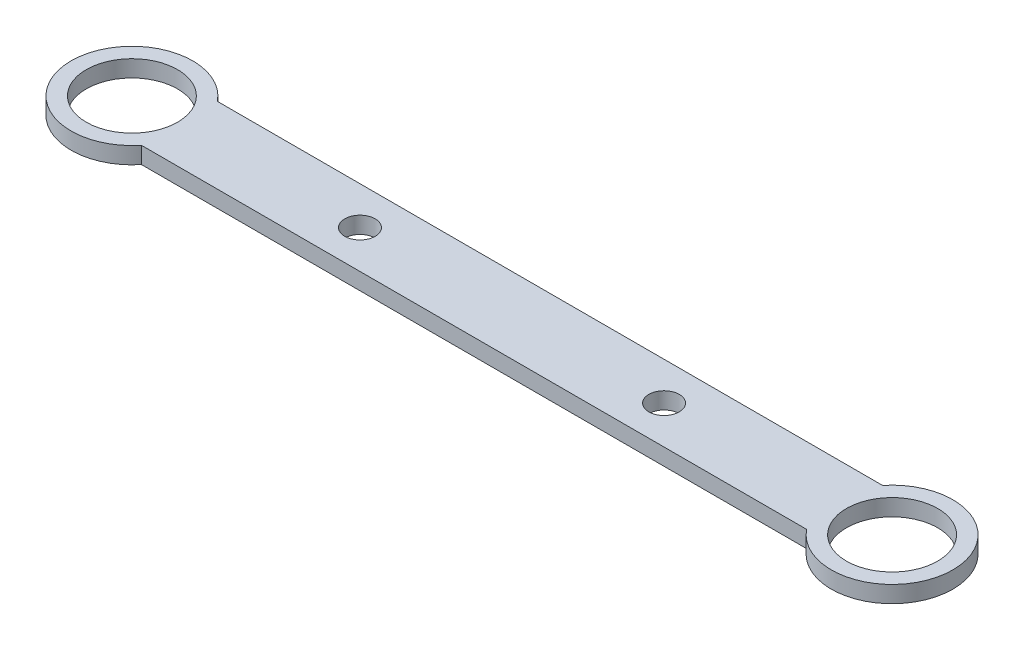
ISO-10303-21;
HEADER;
FILE_DESCRIPTION(('STEP AP214'),'2;1');
FILE_NAME('part.step','',(''),(''),'','','');
FILE_SCHEMA(('AUTOMOTIVE_DESIGN { 1 0 10303 214 1 1 1 1 }'));
ENDSEC;
DATA;
#1=APPLICATION_CONTEXT('core data for automotive mechanical design processes');
#2=APPLICATION_PROTOCOL_DEFINITION('international standard','automotive_design',2000,#1);
#3=PRODUCT_CONTEXT('',#1,'mechanical');
#4=PRODUCT('Part','Part','',(#3));
#5=PRODUCT_RELATED_PRODUCT_CATEGORY('part','',(#4));
#6=PRODUCT_DEFINITION_FORMATION('','',#4);
#7=PRODUCT_DEFINITION_CONTEXT('part definition',#1,'design');
#8=PRODUCT_DEFINITION('design','',#6,#7);
#9=PRODUCT_DEFINITION_SHAPE('','',#8);
#10=(LENGTH_UNIT() NAMED_UNIT(*) SI_UNIT(.MILLI.,.METRE.));
#11=(NAMED_UNIT(*) PLANE_ANGLE_UNIT() SI_UNIT($,.RADIAN.));
#12=(NAMED_UNIT(*) SI_UNIT($,.STERADIAN.) SOLID_ANGLE_UNIT());
#13=UNCERTAINTY_MEASURE_WITH_UNIT(LENGTH_MEASURE(1.E-05),#10,'distance_accuracy_value','');
#14=(GEOMETRIC_REPRESENTATION_CONTEXT(3) GLOBAL_UNCERTAINTY_ASSIGNED_CONTEXT((#13)) GLOBAL_UNIT_ASSIGNED_CONTEXT((#10,
#11,#12)) REPRESENTATION_CONTEXT('',''));
#15=CARTESIAN_POINT('',(0.,0.,0.));
#16=DIRECTION('',(0.,0.,1.));
#17=DIRECTION('',(1.,0.,0.));
#18=AXIS2_PLACEMENT_3D('',#15,#16,#17);
#19=CARTESIAN_POINT('',(0.,1.1,0.));
#20=DIRECTION('',(0.,1.,0.));
#21=DIRECTION('',(0.,0.,1.));
#22=AXIS2_PLACEMENT_3D('',#19,#20,#21);
#23=PLANE('',#22);
#24=CARTESIAN_POINT('',(0.,1.1,0.));
#25=DIRECTION('',(0.,1.,0.));
#26=DIRECTION('',(0.,0.,1.));
#27=AXIS2_PLACEMENT_3D('',#24,#25,#26);
#28=CIRCLE('',#27,4.);
#29=CARTESIAN_POINT('',(3.1224989991992,1.1,-2.5));
#30=VERTEX_POINT('',#29);
#31=CARTESIAN_POINT('',(3.1224989991992,1.1,2.5));
#32=VERTEX_POINT('',#31);
#33=EDGE_CURVE('E246',#30,#32,#28,.T.);
#34=ORIENTED_EDGE('',*,*,#33,.T.);
#35=DIRECTION('',(1.,0.,0.));
#36=VECTOR('',#35,1.);
#37=CARTESIAN_POINT('',(3.1224989991992,1.1,2.5));
#38=LINE('',#37,#36);
#39=CARTESIAN_POINT('',(46.8775010008008,1.1,2.5));
#40=VERTEX_POINT('',#39);
#41=EDGE_CURVE('E167',#32,#40,#38,.T.);
#42=ORIENTED_EDGE('',*,*,#41,.T.);
#43=CARTESIAN_POINT('',(50.,1.1,0.));
#44=DIRECTION('',(0.,1.,0.));
#45=DIRECTION('',(0.,0.,1.));
#46=AXIS2_PLACEMENT_3D('',#43,#44,#45);
#47=CIRCLE('',#46,4.);
#48=CARTESIAN_POINT('',(46.8775010008008,1.1,-2.5));
#49=VERTEX_POINT('',#48);
#50=EDGE_CURVE('E162',#40,#49,#47,.T.);
#51=ORIENTED_EDGE('',*,*,#50,.T.);
#52=DIRECTION('',(1.,0.,0.));
#53=VECTOR('',#52,1.);
#54=CARTESIAN_POINT('',(3.1224989991992,1.1,-2.5));
#55=LINE('',#54,#53);
#56=EDGE_CURVE('E156',#30,#49,#55,.T.);
#57=ORIENTED_EDGE('',*,*,#56,.F.);
#58=EDGE_LOOP('',(#34,#42,#51,#57));
#59=FACE_BOUND('',#58,.T.);
#60=CARTESIAN_POINT('',(0.,1.1,0.));
#61=DIRECTION('',(0.,1.,0.));
#62=DIRECTION('',(0.,0.,1.));
#63=AXIS2_PLACEMENT_3D('',#60,#61,#62);
#64=CIRCLE('',#63,3.);
#65=CARTESIAN_POINT('',(0.,1.1,3.));
#66=VERTEX_POINT('',#65);
#67=EDGE_CURVE('E240',#66,#66,#64,.T.);
#68=ORIENTED_EDGE('',*,*,#67,.F.);
#69=EDGE_LOOP('',(#68));
#70=FACE_BOUND('',#69,.T.);
#71=CARTESIAN_POINT('',(15.,1.1,0.));
#72=DIRECTION('',(0.,1.,0.));
#73=DIRECTION('',(0.,0.,1.));
#74=AXIS2_PLACEMENT_3D('',#71,#72,#73);
#75=CIRCLE('',#74,1.);
#76=CARTESIAN_POINT('',(15.,1.1,1.));
#77=VERTEX_POINT('',#76);
#78=EDGE_CURVE('E172',#77,#77,#75,.T.);
#79=ORIENTED_EDGE('',*,*,#78,.F.);
#80=EDGE_LOOP('',(#79));
#81=FACE_BOUND('',#80,.T.);
#82=CARTESIAN_POINT('',(35.,1.1,0.));
#83=DIRECTION('',(0.,1.,0.));
#84=DIRECTION('',(0.,0.,1.));
#85=AXIS2_PLACEMENT_3D('',#82,#83,#84);
#86=CIRCLE('',#85,0.999999999999998);
#87=CARTESIAN_POINT('',(35.,1.1,0.999999999999998));
#88=VERTEX_POINT('',#87);
#89=EDGE_CURVE('E185',#88,#88,#86,.T.);
#90=ORIENTED_EDGE('',*,*,#89,.F.);
#91=EDGE_LOOP('',(#90));
#92=FACE_BOUND('',#91,.T.);
#93=CARTESIAN_POINT('',(50.,1.1,0.));
#94=DIRECTION('',(0.,1.,0.));
#95=DIRECTION('',(0.,0.,1.));
#96=AXIS2_PLACEMENT_3D('',#93,#94,#95);
#97=CIRCLE('',#96,3.);
#98=CARTESIAN_POINT('',(50.,1.1,3.));
#99=VERTEX_POINT('',#98);
#100=EDGE_CURVE('E163',#99,#99,#97,.T.);
#101=ORIENTED_EDGE('',*,*,#100,.F.);
#102=EDGE_LOOP('',(#101));
#103=FACE_BOUND('',#102,.T.);
#104=ADVANCED_FACE('F110',(#59,#70,#81,#92,#103),#23,.T.);
#105=CARTESIAN_POINT('',(0.,1.1,0.));
#106=DIRECTION('',(0.,-1.,0.));
#107=DIRECTION('',(0.,0.,-1.));
#108=AXIS2_PLACEMENT_3D('',#105,#106,#107);
#109=CYLINDRICAL_SURFACE('',#108,3.);
#110=ORIENTED_EDGE('',*,*,#67,.T.);
#111=EDGE_LOOP('',(#110));
#112=FACE_BOUND('',#111,.T.);
#113=CARTESIAN_POINT('',(0.,0.,0.));
#114=DIRECTION('',(0.,1.,0.));
#115=DIRECTION('',(0.,0.,1.));
#116=AXIS2_PLACEMENT_3D('',#113,#114,#115);
#117=CIRCLE('',#116,3.);
#118=CARTESIAN_POINT('',(0.,0.,3.));
#119=VERTEX_POINT('',#118);
#120=EDGE_CURVE('E177',#119,#119,#117,.T.);
#121=ORIENTED_EDGE('',*,*,#120,.F.);
#122=EDGE_LOOP('',(#121));
#123=FACE_BOUND('',#122,.T.);
#124=ADVANCED_FACE('F225',(#112,#123),#109,.F.);
#125=CARTESIAN_POINT('',(0.,0.,0.));
#126=DIRECTION('',(0.,1.,0.));
#127=DIRECTION('',(0.,0.,1.));
#128=AXIS2_PLACEMENT_3D('',#125,#126,#127);
#129=PLANE('',#128);
#130=CARTESIAN_POINT('',(0.,0.,0.));
#131=DIRECTION('',(0.,1.,0.));
#132=DIRECTION('',(0.,0.,1.));
#133=AXIS2_PLACEMENT_3D('',#130,#131,#132);
#134=CIRCLE('',#133,4.);
#135=CARTESIAN_POINT('',(3.1224989991992,0.,-2.5));
#136=VERTEX_POINT('',#135);
#137=CARTESIAN_POINT('',(3.1224989991992,0.,2.5));
#138=VERTEX_POINT('',#137);
#139=EDGE_CURVE('E166',#136,#138,#134,.T.);
#140=ORIENTED_EDGE('',*,*,#139,.F.);
#141=DIRECTION('',(1.,0.,0.));
#142=VECTOR('',#141,1.);
#143=CARTESIAN_POINT('',(3.1224989991992,0.,-2.5));
#144=LINE('',#143,#142);
#145=CARTESIAN_POINT('',(46.8775010008008,0.,-2.5));
#146=VERTEX_POINT('',#145);
#147=EDGE_CURVE('E153',#136,#146,#144,.T.);
#148=ORIENTED_EDGE('',*,*,#147,.T.);
#149=CARTESIAN_POINT('',(50.,0.,0.));
#150=DIRECTION('',(0.,1.,0.));
#151=DIRECTION('',(0.,0.,1.));
#152=AXIS2_PLACEMENT_3D('',#149,#150,#151);
#153=CIRCLE('',#152,4.);
#154=CARTESIAN_POINT('',(46.8775010008008,0.,2.5));
#155=VERTEX_POINT('',#154);
#156=EDGE_CURVE('E114',#155,#146,#153,.T.);
#157=ORIENTED_EDGE('',*,*,#156,.F.);
#158=DIRECTION('',(1.,0.,0.));
#159=VECTOR('',#158,1.);
#160=CARTESIAN_POINT('',(3.1224989991992,0.,2.5));
#161=LINE('',#160,#159);
#162=EDGE_CURVE('E168',#138,#155,#161,.T.);
#163=ORIENTED_EDGE('',*,*,#162,.F.);
#164=EDGE_LOOP('',(#140,#148,#157,#163));
#165=FACE_BOUND('',#164,.T.);
#166=ORIENTED_EDGE('',*,*,#120,.T.);
#167=EDGE_LOOP('',(#166));
#168=FACE_BOUND('',#167,.T.);
#169=CARTESIAN_POINT('',(15.,0.,0.));
#170=DIRECTION('',(0.,1.,0.));
#171=DIRECTION('',(0.,0.,1.));
#172=AXIS2_PLACEMENT_3D('',#169,#170,#171);
#173=CIRCLE('',#172,1.);
#174=CARTESIAN_POINT('',(15.,0.,1.));
#175=VERTEX_POINT('',#174);
#176=EDGE_CURVE('E190',#175,#175,#173,.T.);
#177=ORIENTED_EDGE('',*,*,#176,.T.);
#178=EDGE_LOOP('',(#177));
#179=FACE_BOUND('',#178,.T.);
#180=CARTESIAN_POINT('',(35.,0.,0.));
#181=DIRECTION('',(0.,1.,0.));
#182=DIRECTION('',(0.,0.,1.));
#183=AXIS2_PLACEMENT_3D('',#180,#181,#182);
#184=CIRCLE('',#183,0.999999999999998);
#185=CARTESIAN_POINT('',(35.,0.,0.999999999999998));
#186=VERTEX_POINT('',#185);
#187=EDGE_CURVE('E182',#186,#186,#184,.T.);
#188=ORIENTED_EDGE('',*,*,#187,.T.);
#189=EDGE_LOOP('',(#188));
#190=FACE_BOUND('',#189,.T.);
#191=CARTESIAN_POINT('',(50.,0.,0.));
#192=DIRECTION('',(0.,1.,0.));
#193=DIRECTION('',(0.,0.,1.));
#194=AXIS2_PLACEMENT_3D('',#191,#192,#193);
#195=CIRCLE('',#194,3.);
#196=CARTESIAN_POINT('',(50.,0.,3.));
#197=VERTEX_POINT('',#196);
#198=EDGE_CURVE('E180',#197,#197,#195,.T.);
#199=ORIENTED_EDGE('',*,*,#198,.T.);
#200=EDGE_LOOP('',(#199));
#201=FACE_BOUND('',#200,.T.);
#202=ADVANCED_FACE('F164',(#165,#168,#179,#190,#201),#129,.F.);
#203=CARTESIAN_POINT('',(0.,1.1,0.));
#204=DIRECTION('',(0.,-1.,0.));
#205=DIRECTION('',(0.,0.,-1.));
#206=AXIS2_PLACEMENT_3D('',#203,#204,#205);
#207=CYLINDRICAL_SURFACE('',#206,4.);
#208=ORIENTED_EDGE('',*,*,#33,.F.);
#209=DIRECTION('',(0.,-1.,0.));
#210=VECTOR('',#209,1.);
#211=CARTESIAN_POINT('',(3.1224989991992,1.1,-2.5));
#212=LINE('',#211,#210);
#213=EDGE_CURVE('E12',#30,#136,#212,.T.);
#214=ORIENTED_EDGE('',*,*,#213,.T.);
#215=ORIENTED_EDGE('',*,*,#139,.T.);
#216=DIRECTION('',(0.,-1.,0.));
#217=VECTOR('',#216,1.);
#218=CARTESIAN_POINT('',(3.1224989991992,1.1,2.5));
#219=LINE('',#218,#217);
#220=EDGE_CURVE('E120',#32,#138,#219,.T.);
#221=ORIENTED_EDGE('',*,*,#220,.F.);
#222=EDGE_LOOP('',(#208,#214,#215,#221));
#223=FACE_BOUND('',#222,.T.);
#224=ADVANCED_FACE('F214',(#223),#207,.T.);
#225=CARTESIAN_POINT('',(50.,1.1,0.));
#226=DIRECTION('',(0.,-1.,0.));
#227=DIRECTION('',(0.,0.,-1.));
#228=AXIS2_PLACEMENT_3D('',#225,#226,#227);
#229=CYLINDRICAL_SURFACE('',#228,3.);
#230=ORIENTED_EDGE('',*,*,#100,.T.);
#231=EDGE_LOOP('',(#230));
#232=FACE_BOUND('',#231,.T.);
#233=ORIENTED_EDGE('',*,*,#198,.F.);
#234=EDGE_LOOP('',(#233));
#235=FACE_BOUND('',#234,.T.);
#236=ADVANCED_FACE('F209',(#232,#235),#229,.F.);
#237=CARTESIAN_POINT('',(35.,1.1,0.));
#238=DIRECTION('',(0.,-1.,0.));
#239=DIRECTION('',(0.,0.,-1.));
#240=AXIS2_PLACEMENT_3D('',#237,#238,#239);
#241=CYLINDRICAL_SURFACE('',#240,0.999999999999998);
#242=ORIENTED_EDGE('',*,*,#89,.T.);
#243=EDGE_LOOP('',(#242));
#244=FACE_BOUND('',#243,.T.);
#245=ORIENTED_EDGE('',*,*,#187,.F.);
#246=EDGE_LOOP('',(#245));
#247=FACE_BOUND('',#246,.T.);
#248=ADVANCED_FACE('F201',(#244,#247),#241,.F.);
#249=CARTESIAN_POINT('',(15.,1.1,0.));
#250=DIRECTION('',(0.,-1.,0.));
#251=DIRECTION('',(0.,0.,-1.));
#252=AXIS2_PLACEMENT_3D('',#249,#250,#251);
#253=CYLINDRICAL_SURFACE('',#252,1.);
#254=ORIENTED_EDGE('',*,*,#78,.T.);
#255=EDGE_LOOP('',(#254));
#256=FACE_BOUND('',#255,.T.);
#257=ORIENTED_EDGE('',*,*,#176,.F.);
#258=EDGE_LOOP('',(#257));
#259=FACE_BOUND('',#258,.T.);
#260=ADVANCED_FACE('F199',(#256,#259),#253,.F.);
#261=CARTESIAN_POINT('',(50.,1.1,0.));
#262=DIRECTION('',(0.,-1.,0.));
#263=DIRECTION('',(0.,0.,-1.));
#264=AXIS2_PLACEMENT_3D('',#261,#262,#263);
#265=CYLINDRICAL_SURFACE('',#264,4.);
#266=DIRECTION('',(0.,-1.,0.));
#267=VECTOR('',#266,1.);
#268=CARTESIAN_POINT('',(46.8775010008008,1.1,2.5));
#269=LINE('',#268,#267);
#270=EDGE_CURVE('E145',#40,#155,#269,.T.);
#271=ORIENTED_EDGE('',*,*,#270,.T.);
#272=ORIENTED_EDGE('',*,*,#156,.T.);
#273=DIRECTION('',(0.,-1.,0.));
#274=VECTOR('',#273,1.);
#275=CARTESIAN_POINT('',(46.8775010008008,1.1,-2.5));
#276=LINE('',#275,#274);
#277=EDGE_CURVE('E150',#49,#146,#276,.T.);
#278=ORIENTED_EDGE('',*,*,#277,.F.);
#279=ORIENTED_EDGE('',*,*,#50,.F.);
#280=EDGE_LOOP('',(#271,#272,#278,#279));
#281=FACE_BOUND('',#280,.T.);
#282=ADVANCED_FACE('F112',(#281),#265,.T.);
#283=CARTESIAN_POINT('',(3.1224989991992,1.1,2.5));
#284=DIRECTION('',(0.,0.,-1.));
#285=DIRECTION('',(-1.,0.,0.));
#286=AXIS2_PLACEMENT_3D('',#283,#284,#285);
#287=PLANE('',#286);
#288=ORIENTED_EDGE('',*,*,#162,.T.);
#289=ORIENTED_EDGE('',*,*,#270,.F.);
#290=ORIENTED_EDGE('',*,*,#41,.F.);
#291=ORIENTED_EDGE('',*,*,#220,.T.);
#292=EDGE_LOOP('',(#288,#289,#290,#291));
#293=FACE_BOUND('',#292,.T.);
#294=ADVANCED_FACE('F208',(#293),#287,.F.);
#295=CARTESIAN_POINT('',(3.1224989991992,1.1,-2.5));
#296=DIRECTION('',(0.,0.,-1.));
#297=DIRECTION('',(-1.,0.,0.));
#298=AXIS2_PLACEMENT_3D('',#295,#296,#297);
#299=PLANE('',#298);
#300=ORIENTED_EDGE('',*,*,#147,.F.);
#301=ORIENTED_EDGE('',*,*,#213,.F.);
#302=ORIENTED_EDGE('',*,*,#56,.T.);
#303=ORIENTED_EDGE('',*,*,#277,.T.);
#304=EDGE_LOOP('',(#300,#301,#302,#303));
#305=FACE_BOUND('',#304,.T.);
#306=ADVANCED_FACE('F151',(#305),#299,.T.);
#307=CLOSED_SHELL('',(#104,#124,#202,#224,#236,#248,#260,#282,#294,#306));
#308=MANIFOLD_SOLID_BREP('B2',#307);
#309=ADVANCED_BREP_SHAPE_REPRESENTATION('',(#18,#308),#14);
#310=SHAPE_DEFINITION_REPRESENTATION(#9,#309);
ENDSEC;
END-ISO-10303-21;
